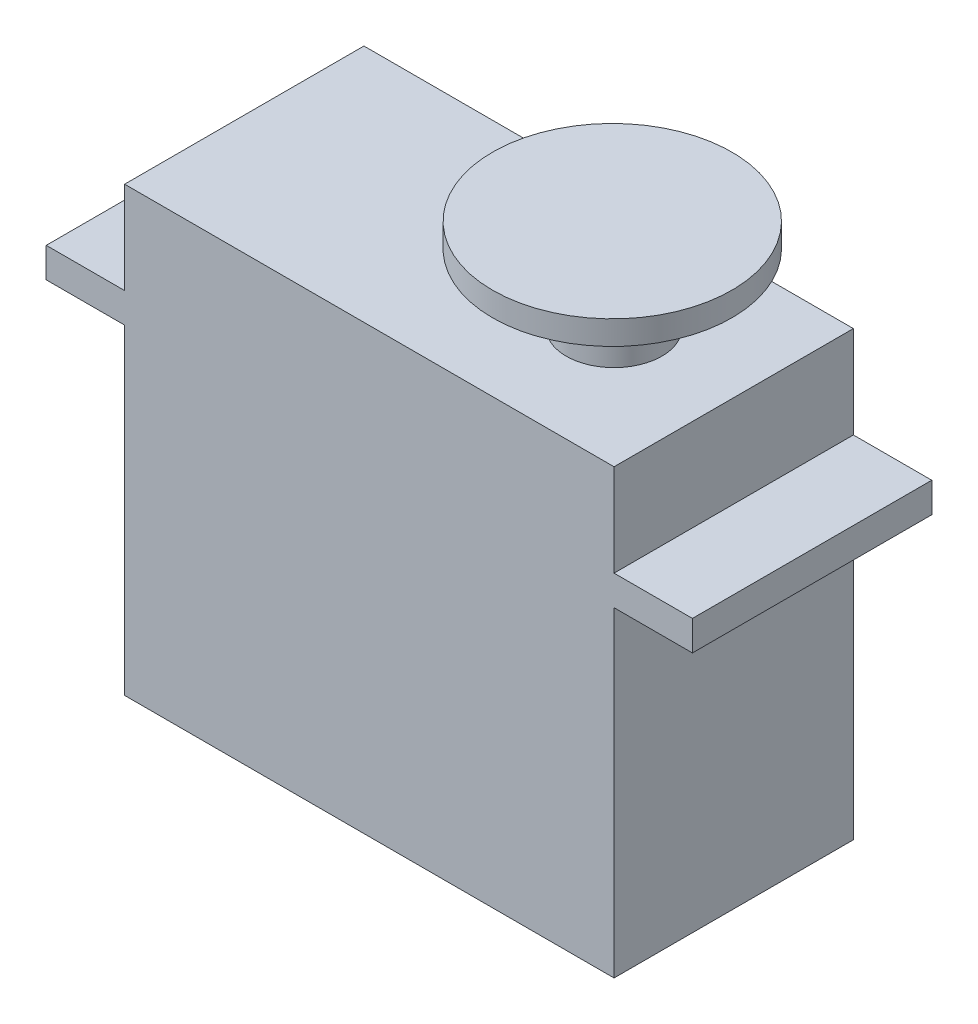
ISO-10303-21;
HEADER;
FILE_DESCRIPTION(('STEP AP214'),'2;1');
FILE_NAME('part.step','',(''),(''),'','','');
FILE_SCHEMA(('AUTOMOTIVE_DESIGN { 1 0 10303 214 1 1 1 1 }'));
ENDSEC;
DATA;
#1=APPLICATION_CONTEXT('core data for automotive mechanical design processes');
#2=APPLICATION_PROTOCOL_DEFINITION('international standard','automotive_design',2000,#1);
#3=PRODUCT_CONTEXT('',#1,'mechanical');
#4=PRODUCT('Part','Part','',(#3));
#5=PRODUCT_RELATED_PRODUCT_CATEGORY('part','',(#4));
#6=PRODUCT_DEFINITION_FORMATION('','',#4);
#7=PRODUCT_DEFINITION_CONTEXT('part definition',#1,'design');
#8=PRODUCT_DEFINITION('design','',#6,#7);
#9=PRODUCT_DEFINITION_SHAPE('','',#8);
#10=(LENGTH_UNIT() NAMED_UNIT(*) SI_UNIT(.MILLI.,.METRE.));
#11=(NAMED_UNIT(*) PLANE_ANGLE_UNIT() SI_UNIT($,.RADIAN.));
#12=(NAMED_UNIT(*) SI_UNIT($,.STERADIAN.) SOLID_ANGLE_UNIT());
#13=UNCERTAINTY_MEASURE_WITH_UNIT(LENGTH_MEASURE(1.E-05),#10,'distance_accuracy_value','');
#14=(GEOMETRIC_REPRESENTATION_CONTEXT(3) GLOBAL_UNCERTAINTY_ASSIGNED_CONTEXT((#13)) GLOBAL_UNIT_ASSIGNED_CONTEXT((#10,
#11,#12)) REPRESENTATION_CONTEXT('',''));
#15=CARTESIAN_POINT('',(0.,0.,0.));
#16=DIRECTION('',(0.,0.,1.));
#17=DIRECTION('',(1.,0.,0.));
#18=AXIS2_PLACEMENT_3D('',#15,#16,#17);
#19=CARTESIAN_POINT('',(0.,10.2,0.));
#20=DIRECTION('',(0.,-1.,0.));
#21=DIRECTION('',(0.,0.,-1.));
#22=AXIS2_PLACEMENT_3D('',#19,#20,#21);
#23=PLANE('',#22);
#24=DIRECTION('',(0.,0.,-1.));
#25=VECTOR('',#24,1.);
#26=CARTESIAN_POINT('',(20.45,10.2,10.));
#27=LINE('',#26,#25);
#28=CARTESIAN_POINT('',(20.45,10.2,10.));
#29=VERTEX_POINT('',#28);
#30=CARTESIAN_POINT('',(20.45,10.2,-10.));
#31=VERTEX_POINT('',#30);
#32=EDGE_CURVE('E134',#29,#31,#27,.T.);
#33=ORIENTED_EDGE('',*,*,#32,.T.);
#34=DIRECTION('',(-1.,0.,0.));
#35=VECTOR('',#34,1.);
#36=CARTESIAN_POINT('',(-20.45,10.2,-10.));
#37=LINE('',#36,#35);
#38=CARTESIAN_POINT('',(-20.45,10.2,-10.));
#39=VERTEX_POINT('',#38);
#40=EDGE_CURVE('E123',#31,#39,#37,.T.);
#41=ORIENTED_EDGE('',*,*,#40,.T.);
#42=DIRECTION('',(0.,0.,1.));
#43=VECTOR('',#42,1.);
#44=CARTESIAN_POINT('',(-20.45,10.2,10.));
#45=LINE('',#44,#43);
#46=CARTESIAN_POINT('',(-20.45,10.2,10.));
#47=VERTEX_POINT('',#46);
#48=EDGE_CURVE('E133',#39,#47,#45,.T.);
#49=ORIENTED_EDGE('',*,*,#48,.T.);
#50=DIRECTION('',(1.,0.,0.));
#51=VECTOR('',#50,1.);
#52=CARTESIAN_POINT('',(-20.45,10.2,10.));
#53=LINE('',#52,#51);
#54=EDGE_CURVE('E139',#47,#29,#53,.T.);
#55=ORIENTED_EDGE('',*,*,#54,.T.);
#56=EDGE_LOOP('',(#33,#41,#49,#55));
#57=FACE_BOUND('',#56,.T.);
#58=CARTESIAN_POINT('',(10.45,10.2,0.));
#59=DIRECTION('',(0.,-1.,0.));
#60=DIRECTION('',(0.,0.,-1.));
#61=AXIS2_PLACEMENT_3D('',#58,#59,#60);
#62=CIRCLE('',#61,4.);
#63=CARTESIAN_POINT('',(10.45,10.2,-4.));
#64=VERTEX_POINT('',#63);
#65=EDGE_CURVE('E11',#64,#64,#62,.F.);
#66=ORIENTED_EDGE('',*,*,#65,.F.);
#67=EDGE_LOOP('',(#66));
#68=FACE_BOUND('',#67,.T.);
#69=ADVANCED_FACE('F34',(#57,#68),#23,.F.);
#70=CARTESIAN_POINT('',(0.,2.5,0.));
#71=DIRECTION('',(0.,-1.,0.));
#72=DIRECTION('',(0.,0.,-1.));
#73=AXIS2_PLACEMENT_3D('',#70,#71,#72);
#74=PLANE('',#73);
#75=DIRECTION('',(0.,0.,-1.));
#76=VECTOR('',#75,1.);
#77=CARTESIAN_POINT('',(20.45,2.5,10.));
#78=LINE('',#77,#76);
#79=CARTESIAN_POINT('',(20.45,2.5,10.));
#80=VERTEX_POINT('',#79);
#81=CARTESIAN_POINT('',(20.45,2.5,-10.));
#82=VERTEX_POINT('',#81);
#83=EDGE_CURVE('E49',#80,#82,#78,.T.);
#84=ORIENTED_EDGE('',*,*,#83,.F.);
#85=DIRECTION('',(1.,0.,0.));
#86=VECTOR('',#85,1.);
#87=CARTESIAN_POINT('',(-27.,2.5,10.));
#88=LINE('',#87,#86);
#89=CARTESIAN_POINT('',(27.,2.5,10.));
#90=VERTEX_POINT('',#89);
#91=EDGE_CURVE('E172',#80,#90,#88,.T.);
#92=ORIENTED_EDGE('',*,*,#91,.T.);
#93=DIRECTION('',(0.,0.,-1.));
#94=VECTOR('',#93,1.);
#95=CARTESIAN_POINT('',(27.,2.5,10.));
#96=LINE('',#95,#94);
#97=CARTESIAN_POINT('',(27.,2.5,-10.));
#98=VERTEX_POINT('',#97);
#99=EDGE_CURVE('E306',#90,#98,#96,.T.);
#100=ORIENTED_EDGE('',*,*,#99,.T.);
#101=DIRECTION('',(-1.,0.,0.));
#102=VECTOR('',#101,1.);
#103=CARTESIAN_POINT('',(-27.,2.5,-10.));
#104=LINE('',#103,#102);
#105=EDGE_CURVE('E301',#98,#82,#104,.T.);
#106=ORIENTED_EDGE('',*,*,#105,.T.);
#107=EDGE_LOOP('',(#84,#92,#100,#106));
#108=FACE_BOUND('',#107,.T.);
#109=ADVANCED_FACE('F212',(#108),#74,.F.);
#110=DIRECTION('',(0.,0.,1.));
#111=VECTOR('',#110,1.);
#112=CARTESIAN_POINT('',(-20.45,2.5,10.));
#113=LINE('',#112,#111);
#114=CARTESIAN_POINT('',(-20.45,2.5,-10.));
#115=VERTEX_POINT('',#114);
#116=CARTESIAN_POINT('',(-20.45,2.5,10.));
#117=VERTEX_POINT('',#116);
#118=EDGE_CURVE('E57',#115,#117,#113,.T.);
#119=ORIENTED_EDGE('',*,*,#118,.F.);
#120=CARTESIAN_POINT('',(-27.,2.5,-10.));
#121=VERTEX_POINT('',#120);
#122=EDGE_CURVE('E304',#115,#121,#104,.T.);
#123=ORIENTED_EDGE('',*,*,#122,.T.);
#124=DIRECTION('',(0.,0.,1.));
#125=VECTOR('',#124,1.);
#126=CARTESIAN_POINT('',(-27.,2.5,10.));
#127=LINE('',#126,#125);
#128=CARTESIAN_POINT('',(-27.,2.5,10.));
#129=VERTEX_POINT('',#128);
#130=EDGE_CURVE('E303',#121,#129,#127,.T.);
#131=ORIENTED_EDGE('',*,*,#130,.T.);
#132=EDGE_CURVE('E294',#129,#117,#88,.T.);
#133=ORIENTED_EDGE('',*,*,#132,.T.);
#134=EDGE_LOOP('',(#119,#123,#131,#133));
#135=FACE_BOUND('',#134,.T.);
#136=ADVANCED_FACE('F217',(#135),#74,.F.);
#137=CARTESIAN_POINT('',(0.,0.,0.));
#138=DIRECTION('',(0.,-1.,0.));
#139=DIRECTION('',(0.,0.,-1.));
#140=AXIS2_PLACEMENT_3D('',#137,#138,#139);
#141=PLANE('',#140);
#142=DIRECTION('',(0.,0.,1.));
#143=VECTOR('',#142,1.);
#144=CARTESIAN_POINT('',(20.45,0.,-10.));
#145=LINE('',#144,#143);
#146=CARTESIAN_POINT('',(20.45,0.,-10.));
#147=VERTEX_POINT('',#146);
#148=CARTESIAN_POINT('',(20.45,0.,10.));
#149=VERTEX_POINT('',#148);
#150=EDGE_CURVE('E145',#147,#149,#145,.T.);
#151=ORIENTED_EDGE('',*,*,#150,.F.);
#152=DIRECTION('',(-1.,0.,0.));
#153=VECTOR('',#152,1.);
#154=CARTESIAN_POINT('',(-27.,0.,-10.));
#155=LINE('',#154,#153);
#156=CARTESIAN_POINT('',(27.,0.,-10.));
#157=VERTEX_POINT('',#156);
#158=EDGE_CURVE('E269',#157,#147,#155,.T.);
#159=ORIENTED_EDGE('',*,*,#158,.F.);
#160=DIRECTION('',(0.,0.,-1.));
#161=VECTOR('',#160,1.);
#162=CARTESIAN_POINT('',(27.,0.,10.));
#163=LINE('',#162,#161);
#164=CARTESIAN_POINT('',(27.,0.,10.));
#165=VERTEX_POINT('',#164);
#166=EDGE_CURVE('E261',#165,#157,#163,.T.);
#167=ORIENTED_EDGE('',*,*,#166,.F.);
#168=DIRECTION('',(1.,0.,0.));
#169=VECTOR('',#168,1.);
#170=CARTESIAN_POINT('',(-27.,0.,10.));
#171=LINE('',#170,#169);
#172=EDGE_CURVE('E285',#149,#165,#171,.T.);
#173=ORIENTED_EDGE('',*,*,#172,.F.);
#174=EDGE_LOOP('',(#151,#159,#167,#173));
#175=FACE_BOUND('',#174,.T.);
#176=ADVANCED_FACE('F242',(#175),#141,.T.);
#177=CARTESIAN_POINT('',(27.,2.5,10.));
#178=DIRECTION('',(-1.,0.,0.));
#179=DIRECTION('',(0.,0.,1.));
#180=AXIS2_PLACEMENT_3D('',#177,#178,#179);
#181=PLANE('',#180);
#182=ORIENTED_EDGE('',*,*,#166,.T.);
#183=DIRECTION('',(0.,-1.,0.));
#184=VECTOR('',#183,1.);
#185=CARTESIAN_POINT('',(27.,2.5,-10.));
#186=LINE('',#185,#184);
#187=EDGE_CURVE('E42',#98,#157,#186,.T.);
#188=ORIENTED_EDGE('',*,*,#187,.F.);
#189=ORIENTED_EDGE('',*,*,#99,.F.);
#190=DIRECTION('',(0.,-1.,0.));
#191=VECTOR('',#190,1.);
#192=CARTESIAN_POINT('',(27.,2.5,10.));
#193=LINE('',#192,#191);
#194=EDGE_CURVE('E265',#90,#165,#193,.T.);
#195=ORIENTED_EDGE('',*,*,#194,.T.);
#196=EDGE_LOOP('',(#182,#188,#189,#195));
#197=FACE_BOUND('',#196,.T.);
#198=ADVANCED_FACE('F36',(#197),#181,.F.);
#199=CARTESIAN_POINT('',(-27.,2.5,-10.));
#200=DIRECTION('',(0.,0.,1.));
#201=DIRECTION('',(1.,0.,0.));
#202=AXIS2_PLACEMENT_3D('',#199,#200,#201);
#203=PLANE('',#202);
#204=ORIENTED_EDGE('',*,*,#158,.T.);
#205=DIRECTION('',(0.,1.,0.));
#206=VECTOR('',#205,1.);
#207=CARTESIAN_POINT('',(20.45,-26.8,-10.));
#208=LINE('',#207,#206);
#209=CARTESIAN_POINT('',(20.45,-26.8,-10.));
#210=VERTEX_POINT('',#209);
#211=EDGE_CURVE('E319',#210,#147,#208,.T.);
#212=ORIENTED_EDGE('',*,*,#211,.F.);
#213=DIRECTION('',(1.,0.,0.));
#214=VECTOR('',#213,1.);
#215=CARTESIAN_POINT('',(-20.45,-26.8,-10.));
#216=LINE('',#215,#214);
#217=CARTESIAN_POINT('',(-20.45,-26.8,-10.));
#218=VERTEX_POINT('',#217);
#219=EDGE_CURVE('E321',#218,#210,#216,.T.);
#220=ORIENTED_EDGE('',*,*,#219,.F.);
#221=DIRECTION('',(0.,1.,0.));
#222=VECTOR('',#221,1.);
#223=CARTESIAN_POINT('',(-20.45,-26.8,-10.));
#224=LINE('',#223,#222);
#225=CARTESIAN_POINT('',(-20.45,0.,-10.));
#226=VERTEX_POINT('',#225);
#227=EDGE_CURVE('E320',#218,#226,#224,.T.);
#228=ORIENTED_EDGE('',*,*,#227,.T.);
#229=CARTESIAN_POINT('',(-27.,0.,-10.));
#230=VERTEX_POINT('',#229);
#231=EDGE_CURVE('E266',#226,#230,#155,.T.);
#232=ORIENTED_EDGE('',*,*,#231,.T.);
#233=DIRECTION('',(0.,-1.,0.));
#234=VECTOR('',#233,1.);
#235=CARTESIAN_POINT('',(-27.,2.5,-10.));
#236=LINE('',#235,#234);
#237=EDGE_CURVE('E297',#121,#230,#236,.T.);
#238=ORIENTED_EDGE('',*,*,#237,.F.);
#239=ORIENTED_EDGE('',*,*,#122,.F.);
#240=DIRECTION('',(0.,-1.,0.));
#241=VECTOR('',#240,1.);
#242=CARTESIAN_POINT('',(-20.45,10.2,-10.));
#243=LINE('',#242,#241);
#244=EDGE_CURVE('E130',#39,#115,#243,.T.);
#245=ORIENTED_EDGE('',*,*,#244,.F.);
#246=ORIENTED_EDGE('',*,*,#40,.F.);
#247=DIRECTION('',(0.,-1.,0.));
#248=VECTOR('',#247,1.);
#249=CARTESIAN_POINT('',(20.45,10.2,-10.));
#250=LINE('',#249,#248);
#251=EDGE_CURVE('E128',#31,#82,#250,.T.);
#252=ORIENTED_EDGE('',*,*,#251,.T.);
#253=ORIENTED_EDGE('',*,*,#105,.F.);
#254=ORIENTED_EDGE('',*,*,#187,.T.);
#255=EDGE_LOOP('',(#204,#212,#220,#228,#232,#238,#239,#245,#246,#252,#253,#254));
#256=FACE_BOUND('',#255,.T.);
#257=ADVANCED_FACE('F126',(#256),#203,.F.);
#258=CARTESIAN_POINT('',(-27.,2.5,10.));
#259=DIRECTION('',(1.,0.,0.));
#260=DIRECTION('',(0.,0.,-1.));
#261=AXIS2_PLACEMENT_3D('',#258,#259,#260);
#262=PLANE('',#261);
#263=DIRECTION('',(0.,0.,1.));
#264=VECTOR('',#263,1.);
#265=CARTESIAN_POINT('',(-27.,0.,10.));
#266=LINE('',#265,#264);
#267=CARTESIAN_POINT('',(-27.,0.,10.));
#268=VERTEX_POINT('',#267);
#269=EDGE_CURVE('E279',#230,#268,#266,.T.);
#270=ORIENTED_EDGE('',*,*,#269,.T.);
#271=DIRECTION('',(0.,-1.,0.));
#272=VECTOR('',#271,1.);
#273=CARTESIAN_POINT('',(-27.,2.5,10.));
#274=LINE('',#273,#272);
#275=EDGE_CURVE('E293',#129,#268,#274,.T.);
#276=ORIENTED_EDGE('',*,*,#275,.F.);
#277=ORIENTED_EDGE('',*,*,#130,.F.);
#278=ORIENTED_EDGE('',*,*,#237,.T.);
#279=EDGE_LOOP('',(#270,#276,#277,#278));
#280=FACE_BOUND('',#279,.T.);
#281=ADVANCED_FACE('F245',(#280),#262,.F.);
#282=CARTESIAN_POINT('',(-27.,2.5,10.));
#283=DIRECTION('',(0.,0.,-1.));
#284=DIRECTION('',(-1.,0.,0.));
#285=AXIS2_PLACEMENT_3D('',#282,#283,#284);
#286=PLANE('',#285);
#287=CARTESIAN_POINT('',(-20.45,0.,10.));
#288=VERTEX_POINT('',#287);
#289=EDGE_CURVE('E287',#268,#288,#171,.T.);
#290=ORIENTED_EDGE('',*,*,#289,.T.);
#291=DIRECTION('',(0.,1.,0.));
#292=VECTOR('',#291,1.);
#293=CARTESIAN_POINT('',(-20.45,-26.8,10.));
#294=LINE('',#293,#292);
#295=CARTESIAN_POINT('',(-20.45,-26.8,10.));
#296=VERTEX_POINT('',#295);
#297=EDGE_CURVE('E272',#296,#288,#294,.T.);
#298=ORIENTED_EDGE('',*,*,#297,.F.);
#299=DIRECTION('',(-1.,0.,0.));
#300=VECTOR('',#299,1.);
#301=CARTESIAN_POINT('',(-20.45,-26.8,10.));
#302=LINE('',#301,#300);
#303=CARTESIAN_POINT('',(20.45,-26.8,10.));
#304=VERTEX_POINT('',#303);
#305=EDGE_CURVE('E328',#304,#296,#302,.T.);
#306=ORIENTED_EDGE('',*,*,#305,.F.);
#307=DIRECTION('',(0.,1.,0.));
#308=VECTOR('',#307,1.);
#309=CARTESIAN_POINT('',(20.45,-26.8,10.));
#310=LINE('',#309,#308);
#311=EDGE_CURVE('E267',#304,#149,#310,.T.);
#312=ORIENTED_EDGE('',*,*,#311,.T.);
#313=ORIENTED_EDGE('',*,*,#172,.T.);
#314=ORIENTED_EDGE('',*,*,#194,.F.);
#315=ORIENTED_EDGE('',*,*,#91,.F.);
#316=DIRECTION('',(0.,-1.,0.));
#317=VECTOR('',#316,1.);
#318=CARTESIAN_POINT('',(20.45,10.2,10.));
#319=LINE('',#318,#317);
#320=EDGE_CURVE('E160',#29,#80,#319,.T.);
#321=ORIENTED_EDGE('',*,*,#320,.F.);
#322=ORIENTED_EDGE('',*,*,#54,.F.);
#323=DIRECTION('',(0.,-1.,0.));
#324=VECTOR('',#323,1.);
#325=CARTESIAN_POINT('',(-20.45,10.2,10.));
#326=LINE('',#325,#324);
#327=EDGE_CURVE('E150',#47,#117,#326,.T.);
#328=ORIENTED_EDGE('',*,*,#327,.T.);
#329=ORIENTED_EDGE('',*,*,#132,.F.);
#330=ORIENTED_EDGE('',*,*,#275,.T.);
#331=EDGE_LOOP('',(#290,#298,#306,#312,#313,#314,#315,#321,#322,#328,#329,#330));
#332=FACE_BOUND('',#331,.T.);
#333=ADVANCED_FACE('F240',(#332),#286,.F.);
#334=DIRECTION('',(0.,0.,-1.));
#335=VECTOR('',#334,1.);
#336=CARTESIAN_POINT('',(-20.45,0.,-10.));
#337=LINE('',#336,#335);
#338=EDGE_CURVE('E148',#288,#226,#337,.T.);
#339=ORIENTED_EDGE('',*,*,#338,.F.);
#340=ORIENTED_EDGE('',*,*,#289,.F.);
#341=ORIENTED_EDGE('',*,*,#269,.F.);
#342=ORIENTED_EDGE('',*,*,#231,.F.);
#343=EDGE_LOOP('',(#339,#340,#341,#342));
#344=FACE_BOUND('',#343,.T.);
#345=ADVANCED_FACE('F235',(#344),#141,.T.);
#346=CARTESIAN_POINT('',(20.45,-26.8,-10.));
#347=DIRECTION('',(-1.,0.,0.));
#348=DIRECTION('',(0.,0.,1.));
#349=AXIS2_PLACEMENT_3D('',#346,#347,#348);
#350=PLANE('',#349);
#351=ORIENTED_EDGE('',*,*,#150,.T.);
#352=ORIENTED_EDGE('',*,*,#311,.F.);
#353=DIRECTION('',(0.,0.,1.));
#354=VECTOR('',#353,1.);
#355=CARTESIAN_POINT('',(20.45,-26.8,-10.));
#356=LINE('',#355,#354);
#357=EDGE_CURVE('E167',#210,#304,#356,.T.);
#358=ORIENTED_EDGE('',*,*,#357,.F.);
#359=ORIENTED_EDGE('',*,*,#211,.T.);
#360=EDGE_LOOP('',(#351,#352,#358,#359));
#361=FACE_BOUND('',#360,.T.);
#362=ADVANCED_FACE('F232',(#361),#350,.F.);
#363=CARTESIAN_POINT('',(-20.45,-26.8,-10.));
#364=DIRECTION('',(1.,0.,0.));
#365=DIRECTION('',(0.,0.,-1.));
#366=AXIS2_PLACEMENT_3D('',#363,#364,#365);
#367=PLANE('',#366);
#368=ORIENTED_EDGE('',*,*,#338,.T.);
#369=ORIENTED_EDGE('',*,*,#227,.F.);
#370=DIRECTION('',(0.,0.,-1.));
#371=VECTOR('',#370,1.);
#372=CARTESIAN_POINT('',(-20.45,-26.8,-10.));
#373=LINE('',#372,#371);
#374=EDGE_CURVE('E327',#296,#218,#373,.T.);
#375=ORIENTED_EDGE('',*,*,#374,.F.);
#376=ORIENTED_EDGE('',*,*,#297,.T.);
#377=EDGE_LOOP('',(#368,#369,#375,#376));
#378=FACE_BOUND('',#377,.T.);
#379=ADVANCED_FACE('F228',(#378),#367,.F.);
#380=CARTESIAN_POINT('',(0.,-26.8,0.));
#381=DIRECTION('',(0.,1.,0.));
#382=DIRECTION('',(0.,0.,1.));
#383=AXIS2_PLACEMENT_3D('',#380,#381,#382);
#384=PLANE('',#383);
#385=ORIENTED_EDGE('',*,*,#357,.T.);
#386=ORIENTED_EDGE('',*,*,#305,.T.);
#387=ORIENTED_EDGE('',*,*,#374,.T.);
#388=ORIENTED_EDGE('',*,*,#219,.T.);
#389=EDGE_LOOP('',(#385,#386,#387,#388));
#390=FACE_BOUND('',#389,.T.);
#391=ADVANCED_FACE('F225',(#390),#384,.F.);
#392=CARTESIAN_POINT('',(20.45,10.2,10.));
#393=DIRECTION('',(-1.,0.,0.));
#394=DIRECTION('',(0.,0.,1.));
#395=AXIS2_PLACEMENT_3D('',#392,#393,#394);
#396=PLANE('',#395);
#397=ORIENTED_EDGE('',*,*,#83,.T.);
#398=ORIENTED_EDGE('',*,*,#251,.F.);
#399=ORIENTED_EDGE('',*,*,#32,.F.);
#400=ORIENTED_EDGE('',*,*,#320,.T.);
#401=EDGE_LOOP('',(#397,#398,#399,#400));
#402=FACE_BOUND('',#401,.T.);
#403=ADVANCED_FACE('F144',(#402),#396,.F.);
#404=CARTESIAN_POINT('',(-20.45,10.2,10.));
#405=DIRECTION('',(1.,0.,0.));
#406=DIRECTION('',(0.,0.,-1.));
#407=AXIS2_PLACEMENT_3D('',#404,#405,#406);
#408=PLANE('',#407);
#409=ORIENTED_EDGE('',*,*,#118,.T.);
#410=ORIENTED_EDGE('',*,*,#327,.F.);
#411=ORIENTED_EDGE('',*,*,#48,.F.);
#412=ORIENTED_EDGE('',*,*,#244,.T.);
#413=EDGE_LOOP('',(#409,#410,#411,#412));
#414=FACE_BOUND('',#413,.T.);
#415=ADVANCED_FACE('F208',(#414),#408,.F.);
#416=CARTESIAN_POINT('',(10.45,15.9,0.));
#417=DIRECTION('',(0.,-1.,0.));
#418=DIRECTION('',(0.,0.,-1.));
#419=AXIS2_PLACEMENT_3D('',#416,#417,#418);
#420=CYLINDRICAL_SURFACE('',#419,4.);
#421=CARTESIAN_POINT('',(10.45,15.9,0.));
#422=DIRECTION('',(0.,1.,0.));
#423=DIRECTION('',(0.,0.,1.));
#424=AXIS2_PLACEMENT_3D('',#421,#422,#423);
#425=CIRCLE('',#424,4.);
#426=CARTESIAN_POINT('',(10.45,15.9,4.));
#427=VERTEX_POINT('',#426);
#428=EDGE_CURVE('E159',#427,#427,#425,.T.);
#429=ORIENTED_EDGE('',*,*,#428,.F.);
#430=EDGE_LOOP('',(#429));
#431=FACE_BOUND('',#430,.T.);
#432=ORIENTED_EDGE('',*,*,#65,.T.);
#433=EDGE_LOOP('',(#432));
#434=FACE_BOUND('',#433,.T.);
#435=ADVANCED_FACE('F202',(#431,#434),#420,.T.);
#436=CARTESIAN_POINT('',(10.3011032481097,15.9,0.));
#437=DIRECTION('',(0.,1.,0.));
#438=DIRECTION('',(0.,0.,1.));
#439=AXIS2_PLACEMENT_3D('',#436,#437,#438);
#440=PLANE('',#439);
#441=CARTESIAN_POINT('',(10.3011032481097,15.9,0.));
#442=DIRECTION('',(0.,1.,0.));
#443=DIRECTION('',(0.,0.,1.));
#444=AXIS2_PLACEMENT_3D('',#441,#442,#443);
#445=CIRCLE('',#444,10.);
#446=CARTESIAN_POINT('',(10.3011032481097,15.9,10.));
#447=VERTEX_POINT('',#446);
#448=EDGE_CURVE('E185',#447,#447,#445,.T.);
#449=ORIENTED_EDGE('',*,*,#448,.F.);
#450=EDGE_LOOP('',(#449));
#451=FACE_BOUND('',#450,.T.);
#452=ORIENTED_EDGE('',*,*,#428,.T.);
#453=EDGE_LOOP('',(#452));
#454=FACE_BOUND('',#453,.T.);
#455=ADVANCED_FACE('F196',(#451,#454),#440,.F.);
#456=CARTESIAN_POINT('',(10.3011032481097,17.9,0.));
#457=DIRECTION('',(0.,-1.,0.));
#458=DIRECTION('',(0.,0.,-1.));
#459=AXIS2_PLACEMENT_3D('',#456,#457,#458);
#460=CYLINDRICAL_SURFACE('',#459,10.);
#461=CARTESIAN_POINT('',(10.3011032481097,17.9,0.));
#462=DIRECTION('',(0.,1.,0.));
#463=DIRECTION('',(0.,0.,1.));
#464=AXIS2_PLACEMENT_3D('',#461,#462,#463);
#465=CIRCLE('',#464,10.);
#466=CARTESIAN_POINT('',(10.3011032481097,17.9,10.));
#467=VERTEX_POINT('',#466);
#468=EDGE_CURVE('E184',#467,#467,#465,.T.);
#469=ORIENTED_EDGE('',*,*,#468,.F.);
#470=EDGE_LOOP('',(#469));
#471=FACE_BOUND('',#470,.T.);
#472=ORIENTED_EDGE('',*,*,#448,.T.);
#473=EDGE_LOOP('',(#472));
#474=FACE_BOUND('',#473,.T.);
#475=ADVANCED_FACE('F193',(#471,#474),#460,.T.);
#476=CARTESIAN_POINT('',(10.3011032481097,17.9,0.));
#477=DIRECTION('',(0.,1.,0.));
#478=DIRECTION('',(0.,0.,1.));
#479=AXIS2_PLACEMENT_3D('',#476,#477,#478);
#480=PLANE('',#479);
#481=ORIENTED_EDGE('',*,*,#468,.T.);
#482=EDGE_LOOP('',(#481));
#483=FACE_BOUND('',#482,.T.);
#484=ADVANCED_FACE('F191',(#483),#480,.T.);
#485=CLOSED_SHELL('',(#69,#109,#136,#176,#198,#257,#281,#333,#345,#362,#379,#391,#403,#415,#435,
#455,#475,#484));
#486=MANIFOLD_SOLID_BREP('B2',#485);
#487=ADVANCED_BREP_SHAPE_REPRESENTATION('',(#18,#486),#14);
#488=SHAPE_DEFINITION_REPRESENTATION(#9,#487);
ENDSEC;
END-ISO-10303-21;
